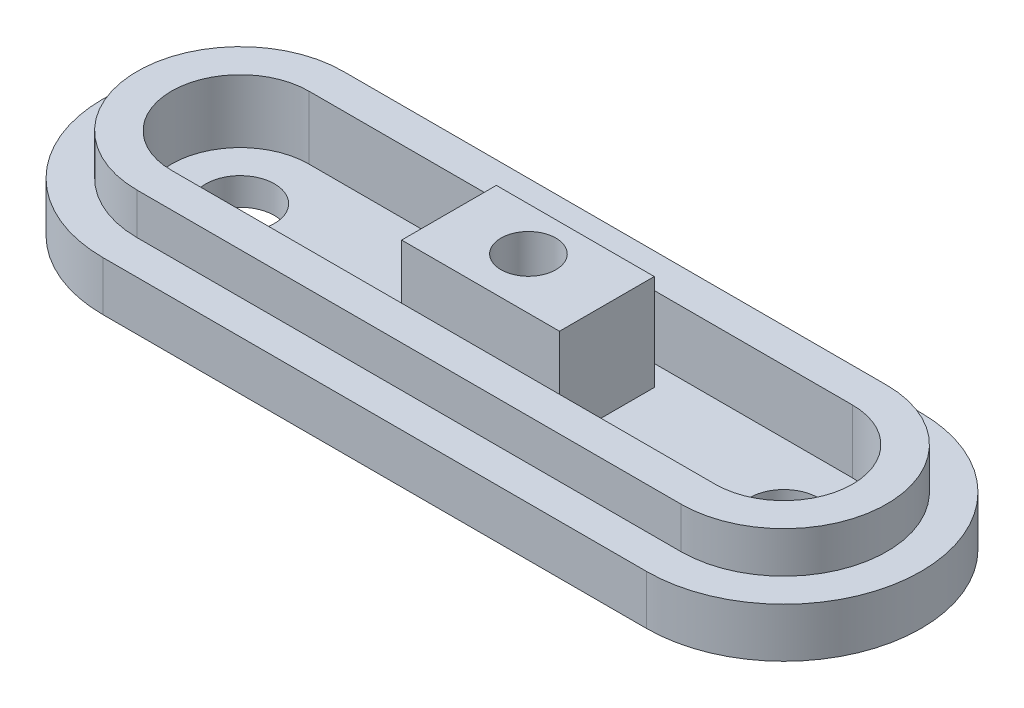
ISO-10303-21;
HEADER;
FILE_DESCRIPTION(('STEP AP214'),'2;1');
FILE_NAME('part.step','',(''),(''),'','','');
FILE_SCHEMA(('AUTOMOTIVE_DESIGN { 1 0 10303 214 1 1 1 1 }'));
ENDSEC;
DATA;
#1=APPLICATION_CONTEXT('core data for automotive mechanical design processes');
#2=APPLICATION_PROTOCOL_DEFINITION('international standard','automotive_design',2000,#1);
#3=PRODUCT_CONTEXT('',#1,'mechanical');
#4=PRODUCT('Part','Part','',(#3));
#5=PRODUCT_RELATED_PRODUCT_CATEGORY('part','',(#4));
#6=PRODUCT_DEFINITION_FORMATION('','',#4);
#7=PRODUCT_DEFINITION_CONTEXT('part definition',#1,'design');
#8=PRODUCT_DEFINITION('design','',#6,#7);
#9=PRODUCT_DEFINITION_SHAPE('','',#8);
#10=(LENGTH_UNIT() NAMED_UNIT(*) SI_UNIT(.MILLI.,.METRE.));
#11=(NAMED_UNIT(*) PLANE_ANGLE_UNIT() SI_UNIT($,.RADIAN.));
#12=(NAMED_UNIT(*) SI_UNIT($,.STERADIAN.) SOLID_ANGLE_UNIT());
#13=UNCERTAINTY_MEASURE_WITH_UNIT(LENGTH_MEASURE(1.E-05),#10,'distance_accuracy_value','');
#14=(GEOMETRIC_REPRESENTATION_CONTEXT(3) GLOBAL_UNCERTAINTY_ASSIGNED_CONTEXT((#13)) GLOBAL_UNIT_ASSIGNED_CONTEXT((#10,
#11,#12)) REPRESENTATION_CONTEXT('',''));
#15=CARTESIAN_POINT('',(0.,0.,0.));
#16=DIRECTION('',(0.,0.,1.));
#17=DIRECTION('',(1.,0.,0.));
#18=AXIS2_PLACEMENT_3D('',#15,#16,#17);
#19=CARTESIAN_POINT('',(201.676156477763,2.,0.327234865387502));
#20=DIRECTION('',(0.,-1.,0.));
#21=DIRECTION('',(0.,0.,-1.));
#22=AXIS2_PLACEMENT_3D('',#19,#20,#21);
#23=PLANE('',#22);
#24=CARTESIAN_POINT('',(201.676156477763,2.,0.327234865387502));
#25=DIRECTION('',(0.,-1.,0.));
#26=DIRECTION('',(0.,0.,-1.));
#27=AXIS2_PLACEMENT_3D('',#24,#25,#26);
#28=CIRCLE('',#27,50.);
#29=CARTESIAN_POINT('',(201.676156477763,2.,-49.6727651346125));
#30=VERTEX_POINT('',#29);
#31=CARTESIAN_POINT('',(201.676156477763,2.,50.3272348653875));
#32=VERTEX_POINT('',#31);
#33=EDGE_CURVE('E187',#30,#32,#28,.T.);
#34=ORIENTED_EDGE('',*,*,#33,.F.);
#35=DIRECTION('',(-1.,0.,0.));
#36=VECTOR('',#35,1.);
#37=CARTESIAN_POINT('',(-194.323843522237,2.,-49.6727651346125));
#38=LINE('',#37,#36);
#39=CARTESIAN_POINT('',(-194.323843522237,2.,-49.6727651346125));
#40=VERTEX_POINT('',#39);
#41=EDGE_CURVE('E195',#30,#40,#38,.T.);
#42=ORIENTED_EDGE('',*,*,#41,.T.);
#43=CARTESIAN_POINT('',(-194.323843522237,2.,0.327234865387502));
#44=DIRECTION('',(0.,-1.,0.));
#45=DIRECTION('',(0.,0.,-1.));
#46=AXIS2_PLACEMENT_3D('',#43,#44,#45);
#47=CIRCLE('',#46,50.);
#48=CARTESIAN_POINT('',(-194.323843522237,2.,50.3272348653875));
#49=VERTEX_POINT('',#48);
#50=EDGE_CURVE('E193',#49,#40,#47,.T.);
#51=ORIENTED_EDGE('',*,*,#50,.F.);
#52=DIRECTION('',(1.,0.,0.));
#53=VECTOR('',#52,1.);
#54=CARTESIAN_POINT('',(-194.323843522237,2.,50.3272348653875));
#55=LINE('',#54,#53);
#56=EDGE_CURVE('E189',#49,#32,#55,.T.);
#57=ORIENTED_EDGE('',*,*,#56,.T.);
#58=EDGE_LOOP('',(#34,#42,#51,#57));
#59=FACE_BOUND('',#58,.T.);
#60=CARTESIAN_POINT('',(201.676156477763,2.,0.327234865387502));
#61=DIRECTION('',(0.,-1.,0.));
#62=DIRECTION('',(0.,0.,-1.));
#63=AXIS2_PLACEMENT_3D('',#60,#61,#62);
#64=CIRCLE('',#63,25.);
#65=CARTESIAN_POINT('',(201.676156477763,2.,-24.6727651346125));
#66=VERTEX_POINT('',#65);
#67=EDGE_CURVE('E184',#66,#66,#64,.F.);
#68=ORIENTED_EDGE('',*,*,#67,.F.);
#69=EDGE_LOOP('',(#68));
#70=FACE_BOUND('',#69,.T.);
#71=CARTESIAN_POINT('',(-194.323843522237,2.,0.327234865387502));
#72=DIRECTION('',(0.,-1.,0.));
#73=DIRECTION('',(0.,0.,-1.));
#74=AXIS2_PLACEMENT_3D('',#71,#72,#73);
#75=CIRCLE('',#74,25.);
#76=CARTESIAN_POINT('',(-194.323843522237,2.,-24.6727651346125));
#77=VERTEX_POINT('',#76);
#78=EDGE_CURVE('E201',#77,#77,#75,.F.);
#79=ORIENTED_EDGE('',*,*,#78,.F.);
#80=EDGE_LOOP('',(#79));
#81=FACE_BOUND('',#80,.T.);
#82=DIRECTION('',(1.,0.,0.));
#83=VECTOR('',#82,1.);
#84=CARTESIAN_POINT('',(201.676156477763,2.,34.5));
#85=LINE('',#84,#83);
#86=CARTESIAN_POINT('',(-42.5384432151375,1.99999999999999,34.5));
#87=VERTEX_POINT('',#86);
#88=CARTESIAN_POINT('',(72.4615567848625,1.99999999999999,34.5));
#89=VERTEX_POINT('',#88);
#90=EDGE_CURVE('E11',#87,#89,#85,.T.);
#91=ORIENTED_EDGE('',*,*,#90,.F.);
#92=DIRECTION('',(0.,0.,1.));
#93=VECTOR('',#92,1.);
#94=CARTESIAN_POINT('',(-42.5384432151375,2.,0.327234865387502));
#95=LINE('',#94,#93);
#96=CARTESIAN_POINT('',(-42.5384432151375,1.99999999999999,-34.5));
#97=VERTEX_POINT('',#96);
#98=EDGE_CURVE('E45',#97,#87,#95,.T.);
#99=ORIENTED_EDGE('',*,*,#98,.F.);
#100=DIRECTION('',(1.,0.,0.));
#101=VECTOR('',#100,1.);
#102=CARTESIAN_POINT('',(201.676156477763,2.,-34.5));
#103=LINE('',#102,#101);
#104=CARTESIAN_POINT('',(72.4615567848625,2.,-34.5));
#105=VERTEX_POINT('',#104);
#106=EDGE_CURVE('E281',#97,#105,#103,.T.);
#107=ORIENTED_EDGE('',*,*,#106,.T.);
#108=DIRECTION('',(0.,0.,-1.));
#109=VECTOR('',#108,1.);
#110=CARTESIAN_POINT('',(72.4615567848625,2.,0.327234865387502));
#111=LINE('',#110,#109);
#112=EDGE_CURVE('E288',#89,#105,#111,.T.);
#113=ORIENTED_EDGE('',*,*,#112,.F.);
#114=EDGE_LOOP('',(#91,#99,#107,#113));
#115=FACE_BOUND('',#114,.T.);
#116=ADVANCED_FACE('F37',(#59,#70,#81,#115),#23,.F.);
#117=CARTESIAN_POINT('',(-194.323843522237,48.,0.327234865387502));
#118=DIRECTION('',(0.,-1.,0.));
#119=DIRECTION('',(0.,0.,-1.));
#120=AXIS2_PLACEMENT_3D('',#117,#118,#119);
#121=PLANE('',#120);
#122=DIRECTION('',(-1.,0.,0.));
#123=VECTOR('',#122,1.);
#124=CARTESIAN_POINT('',(-194.323843522237,48.,75.3272348653875));
#125=LINE('',#124,#123);
#126=CARTESIAN_POINT('',(201.676156477763,48.,75.3272348653875));
#127=VERTEX_POINT('',#126);
#128=CARTESIAN_POINT('',(-194.323843522237,48.,75.3272348653875));
#129=VERTEX_POINT('',#128);
#130=EDGE_CURVE('E216',#127,#129,#125,.T.);
#131=ORIENTED_EDGE('',*,*,#130,.F.);
#132=CARTESIAN_POINT('',(201.676156477763,48.,0.327234865387502));
#133=DIRECTION('',(0.,-1.,0.));
#134=DIRECTION('',(0.,0.,-1.));
#135=AXIS2_PLACEMENT_3D('',#132,#133,#134);
#136=CIRCLE('',#135,75.);
#137=CARTESIAN_POINT('',(201.676156477763,48.,-74.6727651346125));
#138=VERTEX_POINT('',#137);
#139=EDGE_CURVE('E225',#138,#127,#136,.T.);
#140=ORIENTED_EDGE('',*,*,#139,.F.);
#141=DIRECTION('',(1.,0.,0.));
#142=VECTOR('',#141,1.);
#143=CARTESIAN_POINT('',(-194.323843522237,48.,-74.6727651346125));
#144=LINE('',#143,#142);
#145=CARTESIAN_POINT('',(-194.323843522237,48.,-74.6727651346125));
#146=VERTEX_POINT('',#145);
#147=EDGE_CURVE('E222',#146,#138,#144,.T.);
#148=ORIENTED_EDGE('',*,*,#147,.F.);
#149=CARTESIAN_POINT('',(-194.323843522237,48.,0.327234865387502));
#150=DIRECTION('',(0.,-1.,0.));
#151=DIRECTION('',(0.,0.,-1.));
#152=AXIS2_PLACEMENT_3D('',#149,#150,#151);
#153=CIRCLE('',#152,75.);
#154=EDGE_CURVE('E219',#129,#146,#153,.T.);
#155=ORIENTED_EDGE('',*,*,#154,.F.);
#156=EDGE_LOOP('',(#131,#140,#148,#155));
#157=FACE_BOUND('',#156,.T.);
#158=CARTESIAN_POINT('',(201.676156477763,48.,0.327234865387502));
#159=DIRECTION('',(0.,-1.,0.));
#160=DIRECTION('',(0.,0.,-1.));
#161=AXIS2_PLACEMENT_3D('',#158,#159,#160);
#162=CIRCLE('',#161,50.);
#163=CARTESIAN_POINT('',(201.676156477763,48.,-49.6727651346125));
#164=VERTEX_POINT('',#163);
#165=CARTESIAN_POINT('',(201.676156477763,48.,50.3272348653875));
#166=VERTEX_POINT('',#165);
#167=EDGE_CURVE('E60',#164,#166,#162,.T.);
#168=ORIENTED_EDGE('',*,*,#167,.T.);
#169=DIRECTION('',(1.,0.,0.));
#170=VECTOR('',#169,1.);
#171=CARTESIAN_POINT('',(-194.323843522237,48.,50.3272348653875));
#172=LINE('',#171,#170);
#173=CARTESIAN_POINT('',(-194.323843522237,48.,50.3272348653875));
#174=VERTEX_POINT('',#173);
#175=EDGE_CURVE('E200',#174,#166,#172,.T.);
#176=ORIENTED_EDGE('',*,*,#175,.F.);
#177=CARTESIAN_POINT('',(-194.323843522237,48.,0.327234865387502));
#178=DIRECTION('',(0.,-1.,0.));
#179=DIRECTION('',(0.,0.,-1.));
#180=AXIS2_PLACEMENT_3D('',#177,#178,#179);
#181=CIRCLE('',#180,50.);
#182=CARTESIAN_POINT('',(-194.323843522237,48.,-49.6727651346125));
#183=VERTEX_POINT('',#182);
#184=EDGE_CURVE('E204',#174,#183,#181,.T.);
#185=ORIENTED_EDGE('',*,*,#184,.T.);
#186=DIRECTION('',(-1.,0.,0.));
#187=VECTOR('',#186,1.);
#188=CARTESIAN_POINT('',(-194.323843522237,48.,-49.6727651346125));
#189=LINE('',#188,#187);
#190=EDGE_CURVE('E190',#164,#183,#189,.T.);
#191=ORIENTED_EDGE('',*,*,#190,.F.);
#192=EDGE_LOOP('',(#168,#176,#185,#191));
#193=FACE_BOUND('',#192,.T.);
#194=ADVANCED_FACE('F306',(#157,#193),#121,.F.);
#195=CARTESIAN_POINT('',(-194.323843522237,18.,0.327234865387502));
#196=DIRECTION('',(0.,-1.,0.));
#197=DIRECTION('',(0.,0.,-1.));
#198=AXIS2_PLACEMENT_3D('',#195,#196,#197);
#199=CYLINDRICAL_SURFACE('',#198,100.);
#200=CARTESIAN_POINT('',(-194.323843522237,-18.,0.327234865387502));
#201=DIRECTION('',(0.,1.,0.));
#202=DIRECTION('',(0.,0.,-1.));
#203=AXIS2_PLACEMENT_3D('',#200,#201,#202);
#204=CIRCLE('',#203,100.);
#205=CARTESIAN_POINT('',(-194.323843522237,-18.,-99.6727651346125));
#206=VERTEX_POINT('',#205);
#207=CARTESIAN_POINT('',(-194.323843522237,-18.,100.327234865388));
#208=VERTEX_POINT('',#207);
#209=EDGE_CURVE('E251',#206,#208,#204,.T.);
#210=ORIENTED_EDGE('',*,*,#209,.T.);
#211=DIRECTION('',(0.,-1.,0.));
#212=VECTOR('',#211,1.);
#213=CARTESIAN_POINT('',(-194.323843522237,18.,100.327234865388));
#214=LINE('',#213,#212);
#215=CARTESIAN_POINT('',(-194.323843522237,18.,100.327234865388));
#216=VERTEX_POINT('',#215);
#217=EDGE_CURVE('E278',#216,#208,#214,.T.);
#218=ORIENTED_EDGE('',*,*,#217,.F.);
#219=CARTESIAN_POINT('',(-194.323843522237,18.,0.327234865387502));
#220=DIRECTION('',(0.,1.,0.));
#221=DIRECTION('',(0.,0.,-1.));
#222=AXIS2_PLACEMENT_3D('',#219,#220,#221);
#223=CIRCLE('',#222,100.);
#224=CARTESIAN_POINT('',(-194.323843522237,18.,-99.6727651346125));
#225=VERTEX_POINT('',#224);
#226=EDGE_CURVE('E252',#225,#216,#223,.T.);
#227=ORIENTED_EDGE('',*,*,#226,.F.);
#228=DIRECTION('',(0.,-1.,0.));
#229=VECTOR('',#228,1.);
#230=CARTESIAN_POINT('',(-194.323843522237,18.,-99.6727651346125));
#231=LINE('',#230,#229);
#232=EDGE_CURVE('E262',#225,#206,#231,.T.);
#233=ORIENTED_EDGE('',*,*,#232,.T.);
#234=EDGE_LOOP('',(#210,#218,#227,#233));
#235=FACE_BOUND('',#234,.T.);
#236=ADVANCED_FACE('F39',(#235),#199,.T.);
#237=CARTESIAN_POINT('',(-194.323843522237,18.,100.327234865388));
#238=DIRECTION('',(0.,0.,-1.));
#239=DIRECTION('',(-1.,0.,0.));
#240=AXIS2_PLACEMENT_3D('',#237,#238,#239);
#241=PLANE('',#240);
#242=DIRECTION('',(1.,0.,0.));
#243=VECTOR('',#242,1.);
#244=CARTESIAN_POINT('',(-194.323843522237,-18.,100.327234865388));
#245=LINE('',#244,#243);
#246=CARTESIAN_POINT('',(201.676156477763,-18.,100.327234865388));
#247=VERTEX_POINT('',#246);
#248=EDGE_CURVE('E265',#208,#247,#245,.T.);
#249=ORIENTED_EDGE('',*,*,#248,.T.);
#250=DIRECTION('',(0.,-1.,0.));
#251=VECTOR('',#250,1.);
#252=CARTESIAN_POINT('',(201.676156477763,18.,100.327234865388));
#253=LINE('',#252,#251);
#254=CARTESIAN_POINT('',(201.676156477763,18.,100.327234865388));
#255=VERTEX_POINT('',#254);
#256=EDGE_CURVE('E275',#255,#247,#253,.T.);
#257=ORIENTED_EDGE('',*,*,#256,.F.);
#258=DIRECTION('',(1.,0.,0.));
#259=VECTOR('',#258,1.);
#260=CARTESIAN_POINT('',(-194.323843522237,18.,100.327234865388));
#261=LINE('',#260,#259);
#262=EDGE_CURVE('E255',#216,#255,#261,.T.);
#263=ORIENTED_EDGE('',*,*,#262,.F.);
#264=ORIENTED_EDGE('',*,*,#217,.T.);
#265=EDGE_LOOP('',(#249,#257,#263,#264));
#266=FACE_BOUND('',#265,.T.);
#267=ADVANCED_FACE('F365',(#266),#241,.F.);
#268=CARTESIAN_POINT('',(201.676156477763,18.,0.327234865387502));
#269=DIRECTION('',(0.,-1.,0.));
#270=DIRECTION('',(0.,0.,-1.));
#271=AXIS2_PLACEMENT_3D('',#268,#269,#270);
#272=CYLINDRICAL_SURFACE('',#271,100.);
#273=CARTESIAN_POINT('',(201.676156477763,-18.,0.327234865387502));
#274=DIRECTION('',(0.,1.,0.));
#275=DIRECTION('',(0.,0.,1.));
#276=AXIS2_PLACEMENT_3D('',#273,#274,#275);
#277=CIRCLE('',#276,100.);
#278=CARTESIAN_POINT('',(201.676156477763,-18.,-99.6727651346125));
#279=VERTEX_POINT('',#278);
#280=EDGE_CURVE('E267',#247,#279,#277,.T.);
#281=ORIENTED_EDGE('',*,*,#280,.T.);
#282=DIRECTION('',(0.,-1.,0.));
#283=VECTOR('',#282,1.);
#284=CARTESIAN_POINT('',(201.676156477763,18.,-99.6727651346125));
#285=LINE('',#284,#283);
#286=CARTESIAN_POINT('',(201.676156477763,18.,-99.6727651346125));
#287=VERTEX_POINT('',#286);
#288=EDGE_CURVE('E272',#287,#279,#285,.T.);
#289=ORIENTED_EDGE('',*,*,#288,.F.);
#290=CARTESIAN_POINT('',(201.676156477763,18.,0.327234865387502));
#291=DIRECTION('',(0.,1.,0.));
#292=DIRECTION('',(0.,0.,1.));
#293=AXIS2_PLACEMENT_3D('',#290,#291,#292);
#294=CIRCLE('',#293,100.);
#295=EDGE_CURVE('E258',#255,#287,#294,.T.);
#296=ORIENTED_EDGE('',*,*,#295,.F.);
#297=ORIENTED_EDGE('',*,*,#256,.T.);
#298=EDGE_LOOP('',(#281,#289,#296,#297));
#299=FACE_BOUND('',#298,.T.);
#300=ADVANCED_FACE('F362',(#299),#272,.T.);
#301=CARTESIAN_POINT('',(-194.323843522237,18.,-99.6727651346125));
#302=DIRECTION('',(0.,0.,1.));
#303=DIRECTION('',(1.,0.,0.));
#304=AXIS2_PLACEMENT_3D('',#301,#302,#303);
#305=PLANE('',#304);
#306=DIRECTION('',(-1.,0.,0.));
#307=VECTOR('',#306,1.);
#308=CARTESIAN_POINT('',(-194.323843522237,-18.,-99.6727651346125));
#309=LINE('',#308,#307);
#310=EDGE_CURVE('E256',#279,#206,#309,.T.);
#311=ORIENTED_EDGE('',*,*,#310,.T.);
#312=ORIENTED_EDGE('',*,*,#232,.F.);
#313=DIRECTION('',(-1.,0.,0.));
#314=VECTOR('',#313,1.);
#315=CARTESIAN_POINT('',(-194.323843522237,18.,-99.6727651346125));
#316=LINE('',#315,#314);
#317=EDGE_CURVE('E260',#287,#225,#316,.T.);
#318=ORIENTED_EDGE('',*,*,#317,.F.);
#319=ORIENTED_EDGE('',*,*,#288,.T.);
#320=EDGE_LOOP('',(#311,#312,#318,#319));
#321=FACE_BOUND('',#320,.T.);
#322=ADVANCED_FACE('F355',(#321),#305,.F.);
#323=CARTESIAN_POINT('',(-194.323843522237,18.,0.327234865387502));
#324=DIRECTION('',(0.,-1.,0.));
#325=DIRECTION('',(0.,0.,-1.));
#326=AXIS2_PLACEMENT_3D('',#323,#324,#325);
#327=PLANE('',#326);
#328=CARTESIAN_POINT('',(201.676156477763,18.,0.327234865387502));
#329=DIRECTION('',(0.,-1.,0.));
#330=DIRECTION('',(0.,0.,-1.));
#331=AXIS2_PLACEMENT_3D('',#328,#329,#330);
#332=CIRCLE('',#331,75.);
#333=CARTESIAN_POINT('',(201.676156477763,18.,-74.6727651346125));
#334=VERTEX_POINT('',#333);
#335=CARTESIAN_POINT('',(201.676156477763,18.,75.3272348653875));
#336=VERTEX_POINT('',#335);
#337=EDGE_CURVE('E245',#334,#336,#332,.T.);
#338=ORIENTED_EDGE('',*,*,#337,.T.);
#339=DIRECTION('',(-1.,0.,0.));
#340=VECTOR('',#339,1.);
#341=CARTESIAN_POINT('',(-194.323843522237,18.,75.3272348653875));
#342=LINE('',#341,#340);
#343=CARTESIAN_POINT('',(-194.323843522237,18.,75.3272348653875));
#344=VERTEX_POINT('',#343);
#345=EDGE_CURVE('E248',#336,#344,#342,.T.);
#346=ORIENTED_EDGE('',*,*,#345,.T.);
#347=CARTESIAN_POINT('',(-194.323843522237,18.,0.327234865387502));
#348=DIRECTION('',(0.,-1.,0.));
#349=DIRECTION('',(0.,0.,-1.));
#350=AXIS2_PLACEMENT_3D('',#347,#348,#349);
#351=CIRCLE('',#350,75.);
#352=CARTESIAN_POINT('',(-194.323843522237,18.,-74.6727651346125));
#353=VERTEX_POINT('',#352);
#354=EDGE_CURVE('E232',#344,#353,#351,.T.);
#355=ORIENTED_EDGE('',*,*,#354,.T.);
#356=DIRECTION('',(1.,0.,0.));
#357=VECTOR('',#356,1.);
#358=CARTESIAN_POINT('',(-194.323843522237,18.,-74.6727651346125));
#359=LINE('',#358,#357);
#360=EDGE_CURVE('E242',#353,#334,#359,.T.);
#361=ORIENTED_EDGE('',*,*,#360,.T.);
#362=EDGE_LOOP('',(#338,#346,#355,#361));
#363=FACE_BOUND('',#362,.T.);
#364=ORIENTED_EDGE('',*,*,#226,.T.);
#365=ORIENTED_EDGE('',*,*,#262,.T.);
#366=ORIENTED_EDGE('',*,*,#295,.T.);
#367=ORIENTED_EDGE('',*,*,#317,.T.);
#368=EDGE_LOOP('',(#364,#365,#366,#367));
#369=FACE_BOUND('',#368,.T.);
#370=ADVANCED_FACE('F352',(#363,#369),#327,.F.);
#371=CARTESIAN_POINT('',(-194.323843522237,-18.,0.327234865387502));
#372=DIRECTION('',(0.,-1.,0.));
#373=DIRECTION('',(0.,0.,-1.));
#374=AXIS2_PLACEMENT_3D('',#371,#372,#373);
#375=PLANE('',#374);
#376=CARTESIAN_POINT('',(12.3670953048505,-18.,-2.9639564488447));
#377=DIRECTION('',(0.,-1.,0.));
#378=DIRECTION('',(0.,0.,-1.));
#379=AXIS2_PLACEMENT_3D('',#376,#377,#378);
#380=CIRCLE('',#379,20.);
#381=CARTESIAN_POINT('',(12.3670953048505,-18.,17.0360435511553));
#382=VERTEX_POINT('',#381);
#383=EDGE_CURVE('E177',#382,#382,#380,.T.);
#384=ORIENTED_EDGE('',*,*,#383,.F.);
#385=EDGE_LOOP('',(#384));
#386=FACE_BOUND('',#385,.T.);
#387=CARTESIAN_POINT('',(-194.323843522237,-18.,0.327234865387502));
#388=DIRECTION('',(0.,-1.,0.));
#389=DIRECTION('',(0.,0.,-1.));
#390=AXIS2_PLACEMENT_3D('',#387,#388,#389);
#391=CIRCLE('',#390,25.);
#392=CARTESIAN_POINT('',(-194.323843522237,-18.,-24.6727651346125));
#393=VERTEX_POINT('',#392);
#394=EDGE_CURVE('E181',#393,#393,#391,.T.);
#395=ORIENTED_EDGE('',*,*,#394,.F.);
#396=EDGE_LOOP('',(#395));
#397=FACE_BOUND('',#396,.T.);
#398=CARTESIAN_POINT('',(201.676156477763,-18.,0.327234865387502));
#399=DIRECTION('',(0.,-1.,0.));
#400=DIRECTION('',(0.,0.,-1.));
#401=AXIS2_PLACEMENT_3D('',#398,#399,#400);
#402=CIRCLE('',#401,25.);
#403=CARTESIAN_POINT('',(201.676156477763,-18.,-24.6727651346125));
#404=VERTEX_POINT('',#403);
#405=EDGE_CURVE('E164',#404,#404,#402,.T.);
#406=ORIENTED_EDGE('',*,*,#405,.F.);
#407=EDGE_LOOP('',(#406));
#408=FACE_BOUND('',#407,.T.);
#409=ORIENTED_EDGE('',*,*,#209,.F.);
#410=ORIENTED_EDGE('',*,*,#310,.F.);
#411=ORIENTED_EDGE('',*,*,#280,.F.);
#412=ORIENTED_EDGE('',*,*,#248,.F.);
#413=EDGE_LOOP('',(#409,#410,#411,#412));
#414=FACE_BOUND('',#413,.T.);
#415=ADVANCED_FACE('F350',(#386,#397,#408,#414),#375,.T.);
#416=CARTESIAN_POINT('',(-194.323843522237,48.,75.3272348653875));
#417=DIRECTION('',(0.,0.,1.));
#418=DIRECTION('',(1.,0.,0.));
#419=AXIS2_PLACEMENT_3D('',#416,#417,#418);
#420=PLANE('',#419);
#421=ORIENTED_EDGE('',*,*,#345,.F.);
#422=DIRECTION('',(0.,-1.,0.));
#423=VECTOR('',#422,1.);
#424=CARTESIAN_POINT('',(201.676156477763,48.,75.3272348653875));
#425=LINE('',#424,#423);
#426=EDGE_CURVE('E229',#127,#336,#425,.T.);
#427=ORIENTED_EDGE('',*,*,#426,.F.);
#428=ORIENTED_EDGE('',*,*,#130,.T.);
#429=DIRECTION('',(0.,-1.,0.));
#430=VECTOR('',#429,1.);
#431=CARTESIAN_POINT('',(-194.323843522237,48.,75.3272348653875));
#432=LINE('',#431,#430);
#433=EDGE_CURVE('E228',#129,#344,#432,.T.);
#434=ORIENTED_EDGE('',*,*,#433,.T.);
#435=EDGE_LOOP('',(#421,#427,#428,#434));
#436=FACE_BOUND('',#435,.T.);
#437=ADVANCED_FACE('F340',(#436),#420,.T.);
#438=CARTESIAN_POINT('',(201.676156477763,48.,0.327234865387502));
#439=DIRECTION('',(0.,-1.,0.));
#440=DIRECTION('',(0.,0.,-1.));
#441=AXIS2_PLACEMENT_3D('',#438,#439,#440);
#442=CYLINDRICAL_SURFACE('',#441,75.);
#443=ORIENTED_EDGE('',*,*,#337,.F.);
#444=DIRECTION('',(0.,-1.,0.));
#445=VECTOR('',#444,1.);
#446=CARTESIAN_POINT('',(201.676156477763,48.,-74.6727651346125));
#447=LINE('',#446,#445);
#448=EDGE_CURVE('E233',#138,#334,#447,.T.);
#449=ORIENTED_EDGE('',*,*,#448,.F.);
#450=ORIENTED_EDGE('',*,*,#139,.T.);
#451=ORIENTED_EDGE('',*,*,#426,.T.);
#452=EDGE_LOOP('',(#443,#449,#450,#451));
#453=FACE_BOUND('',#452,.T.);
#454=ADVANCED_FACE('F336',(#453),#442,.T.);
#455=CARTESIAN_POINT('',(-194.323843522237,48.,-74.6727651346125));
#456=DIRECTION('',(0.,0.,-1.));
#457=DIRECTION('',(-1.,0.,0.));
#458=AXIS2_PLACEMENT_3D('',#455,#456,#457);
#459=PLANE('',#458);
#460=ORIENTED_EDGE('',*,*,#360,.F.);
#461=DIRECTION('',(0.,-1.,0.));
#462=VECTOR('',#461,1.);
#463=CARTESIAN_POINT('',(-194.323843522237,48.,-74.6727651346125));
#464=LINE('',#463,#462);
#465=EDGE_CURVE('E236',#146,#353,#464,.T.);
#466=ORIENTED_EDGE('',*,*,#465,.F.);
#467=ORIENTED_EDGE('',*,*,#147,.T.);
#468=ORIENTED_EDGE('',*,*,#448,.T.);
#469=EDGE_LOOP('',(#460,#466,#467,#468));
#470=FACE_BOUND('',#469,.T.);
#471=ADVANCED_FACE('F339',(#470),#459,.T.);
#472=CARTESIAN_POINT('',(-194.323843522237,48.,0.327234865387502));
#473=DIRECTION('',(0.,-1.,0.));
#474=DIRECTION('',(0.,0.,-1.));
#475=AXIS2_PLACEMENT_3D('',#472,#473,#474);
#476=CYLINDRICAL_SURFACE('',#475,75.);
#477=ORIENTED_EDGE('',*,*,#354,.F.);
#478=ORIENTED_EDGE('',*,*,#433,.F.);
#479=ORIENTED_EDGE('',*,*,#154,.T.);
#480=ORIENTED_EDGE('',*,*,#465,.T.);
#481=EDGE_LOOP('',(#477,#478,#479,#480));
#482=FACE_BOUND('',#481,.T.);
#483=ADVANCED_FACE('F334',(#482),#476,.T.);
#484=CARTESIAN_POINT('',(201.676156477763,2.,0.327234865387502));
#485=DIRECTION('',(0.,1.,0.));
#486=DIRECTION('',(0.,0.,1.));
#487=AXIS2_PLACEMENT_3D('',#484,#485,#486);
#488=CYLINDRICAL_SURFACE('',#487,50.);
#489=ORIENTED_EDGE('',*,*,#167,.F.);
#490=DIRECTION('',(0.,1.,0.));
#491=VECTOR('',#490,1.);
#492=CARTESIAN_POINT('',(201.676156477763,2.,-49.6727651346125));
#493=LINE('',#492,#491);
#494=EDGE_CURVE('E198',#30,#164,#493,.T.);
#495=ORIENTED_EDGE('',*,*,#494,.F.);
#496=ORIENTED_EDGE('',*,*,#33,.T.);
#497=DIRECTION('',(0.,1.,0.));
#498=VECTOR('',#497,1.);
#499=CARTESIAN_POINT('',(201.676156477763,2.,50.3272348653875));
#500=LINE('',#499,#498);
#501=EDGE_CURVE('E214',#32,#166,#500,.T.);
#502=ORIENTED_EDGE('',*,*,#501,.T.);
#503=EDGE_LOOP('',(#489,#495,#496,#502));
#504=FACE_BOUND('',#503,.T.);
#505=ADVANCED_FACE('F331',(#504),#488,.F.);
#506=CARTESIAN_POINT('',(-194.323843522237,2.,50.3272348653875));
#507=DIRECTION('',(0.,0.,1.));
#508=DIRECTION('',(1.,0.,0.));
#509=AXIS2_PLACEMENT_3D('',#506,#507,#508);
#510=PLANE('',#509);
#511=ORIENTED_EDGE('',*,*,#175,.T.);
#512=ORIENTED_EDGE('',*,*,#501,.F.);
#513=ORIENTED_EDGE('',*,*,#56,.F.);
#514=DIRECTION('',(0.,1.,0.));
#515=VECTOR('',#514,1.);
#516=CARTESIAN_POINT('',(-194.323843522237,2.,50.3272348653875));
#517=LINE('',#516,#515);
#518=EDGE_CURVE('E212',#49,#174,#517,.T.);
#519=ORIENTED_EDGE('',*,*,#518,.T.);
#520=EDGE_LOOP('',(#511,#512,#513,#519));
#521=FACE_BOUND('',#520,.T.);
#522=ADVANCED_FACE('F327',(#521),#510,.F.);
#523=CARTESIAN_POINT('',(-194.323843522237,2.,0.327234865387502));
#524=DIRECTION('',(0.,1.,0.));
#525=DIRECTION('',(0.,0.,1.));
#526=AXIS2_PLACEMENT_3D('',#523,#524,#525);
#527=CYLINDRICAL_SURFACE('',#526,50.);
#528=ORIENTED_EDGE('',*,*,#184,.F.);
#529=ORIENTED_EDGE('',*,*,#518,.F.);
#530=ORIENTED_EDGE('',*,*,#50,.T.);
#531=DIRECTION('',(0.,1.,0.));
#532=VECTOR('',#531,1.);
#533=CARTESIAN_POINT('',(-194.323843522237,2.,-49.6727651346125));
#534=LINE('',#533,#532);
#535=EDGE_CURVE('E210',#40,#183,#534,.T.);
#536=ORIENTED_EDGE('',*,*,#535,.T.);
#537=EDGE_LOOP('',(#528,#529,#530,#536));
#538=FACE_BOUND('',#537,.T.);
#539=ADVANCED_FACE('F323',(#538),#527,.F.);
#540=CARTESIAN_POINT('',(-194.323843522237,2.,-49.6727651346125));
#541=DIRECTION('',(0.,0.,-1.));
#542=DIRECTION('',(-1.,0.,0.));
#543=AXIS2_PLACEMENT_3D('',#540,#541,#542);
#544=PLANE('',#543);
#545=ORIENTED_EDGE('',*,*,#190,.T.);
#546=ORIENTED_EDGE('',*,*,#535,.F.);
#547=ORIENTED_EDGE('',*,*,#41,.F.);
#548=ORIENTED_EDGE('',*,*,#494,.T.);
#549=EDGE_LOOP('',(#545,#546,#547,#548));
#550=FACE_BOUND('',#549,.T.);
#551=ADVANCED_FACE('F320',(#550),#544,.F.);
#552=CARTESIAN_POINT('',(201.676156477763,-18.,0.327234865387502));
#553=DIRECTION('',(0.,1.,0.));
#554=DIRECTION('',(0.,0.,1.));
#555=AXIS2_PLACEMENT_3D('',#552,#553,#554);
#556=CYLINDRICAL_SURFACE('',#555,25.);
#557=ORIENTED_EDGE('',*,*,#405,.T.);
#558=EDGE_LOOP('',(#557));
#559=FACE_BOUND('',#558,.T.);
#560=ORIENTED_EDGE('',*,*,#67,.T.);
#561=EDGE_LOOP('',(#560));
#562=FACE_BOUND('',#561,.T.);
#563=ADVANCED_FACE('F318',(#559,#562),#556,.F.);
#564=CARTESIAN_POINT('',(-194.323843522237,-18.,0.327234865387502));
#565=DIRECTION('',(0.,1.,0.));
#566=DIRECTION('',(0.,0.,1.));
#567=AXIS2_PLACEMENT_3D('',#564,#565,#566);
#568=CYLINDRICAL_SURFACE('',#567,25.);
#569=ORIENTED_EDGE('',*,*,#394,.T.);
#570=EDGE_LOOP('',(#569));
#571=FACE_BOUND('',#570,.T.);
#572=ORIENTED_EDGE('',*,*,#78,.T.);
#573=EDGE_LOOP('',(#572));
#574=FACE_BOUND('',#573,.T.);
#575=ADVANCED_FACE('F433',(#571,#574),#568,.F.);
#576=CARTESIAN_POINT('',(-42.5384432151375,-18.,34.5));
#577=DIRECTION('',(1.,0.,0.));
#578=DIRECTION('',(0.,0.,-1.));
#579=AXIS2_PLACEMENT_3D('',#576,#577,#578);
#580=PLANE('',#579);
#581=DIRECTION('',(0.,-1.,0.));
#582=VECTOR('',#581,1.);
#583=CARTESIAN_POINT('',(-42.5384432151375,-18.,-34.5));
#584=LINE('',#583,#582);
#585=CARTESIAN_POINT('',(-42.5384432151375,72.,-34.5));
#586=VERTEX_POINT('',#585);
#587=EDGE_CURVE('E174',#586,#97,#584,.T.);
#588=ORIENTED_EDGE('',*,*,#587,.T.);
#589=ORIENTED_EDGE('',*,*,#98,.T.);
#590=DIRECTION('',(0.,-1.,0.));
#591=VECTOR('',#590,1.);
#592=CARTESIAN_POINT('',(-42.5384432151375,-18.,34.5));
#593=LINE('',#592,#591);
#594=CARTESIAN_POINT('',(-42.5384432151375,72.,34.5));
#595=VERTEX_POINT('',#594);
#596=EDGE_CURVE('E158',#595,#87,#593,.T.);
#597=ORIENTED_EDGE('',*,*,#596,.F.);
#598=DIRECTION('',(0.,0.,-1.));
#599=VECTOR('',#598,1.);
#600=CARTESIAN_POINT('',(-42.5384432151375,72.,34.5));
#601=LINE('',#600,#599);
#602=EDGE_CURVE('E165',#595,#586,#601,.T.);
#603=ORIENTED_EDGE('',*,*,#602,.T.);
#604=EDGE_LOOP('',(#588,#589,#597,#603));
#605=FACE_BOUND('',#604,.T.);
#606=ADVANCED_FACE('F291',(#605),#580,.F.);
#607=CARTESIAN_POINT('',(72.4615567848625,-18.,34.5));
#608=DIRECTION('',(-1.,0.,0.));
#609=DIRECTION('',(0.,0.,1.));
#610=AXIS2_PLACEMENT_3D('',#607,#608,#609);
#611=PLANE('',#610);
#612=DIRECTION('',(0.,1.,0.));
#613=VECTOR('',#612,1.);
#614=CARTESIAN_POINT('',(72.4615567848625,-18.,34.5));
#615=LINE('',#614,#613);
#616=CARTESIAN_POINT('',(72.4615567848625,72.,34.5));
#617=VERTEX_POINT('',#616);
#618=EDGE_CURVE('E148',#89,#617,#615,.T.);
#619=ORIENTED_EDGE('',*,*,#618,.F.);
#620=ORIENTED_EDGE('',*,*,#112,.T.);
#621=DIRECTION('',(0.,1.,0.));
#622=VECTOR('',#621,1.);
#623=CARTESIAN_POINT('',(72.4615567848625,-18.,-34.5));
#624=LINE('',#623,#622);
#625=CARTESIAN_POINT('',(72.4615567848625,72.,-34.5));
#626=VERTEX_POINT('',#625);
#627=EDGE_CURVE('E52',#105,#626,#624,.T.);
#628=ORIENTED_EDGE('',*,*,#627,.T.);
#629=DIRECTION('',(0.,0.,-1.));
#630=VECTOR('',#629,1.);
#631=CARTESIAN_POINT('',(72.4615567848625,72.,34.5));
#632=LINE('',#631,#630);
#633=EDGE_CURVE('E161',#617,#626,#632,.T.);
#634=ORIENTED_EDGE('',*,*,#633,.F.);
#635=EDGE_LOOP('',(#619,#620,#628,#634));
#636=FACE_BOUND('',#635,.T.);
#637=ADVANCED_FACE('F162',(#636),#611,.F.);
#638=CARTESIAN_POINT('',(0.,0.,34.5));
#639=DIRECTION('',(0.,0.,-1.));
#640=DIRECTION('',(-1.,0.,0.));
#641=AXIS2_PLACEMENT_3D('',#638,#639,#640);
#642=PLANE('',#641);
#643=ORIENTED_EDGE('',*,*,#596,.T.);
#644=ORIENTED_EDGE('',*,*,#90,.T.);
#645=ORIENTED_EDGE('',*,*,#618,.T.);
#646=DIRECTION('',(-1.,0.,0.));
#647=VECTOR('',#646,1.);
#648=CARTESIAN_POINT('',(-42.5384432151375,72.,34.5));
#649=LINE('',#648,#647);
#650=EDGE_CURVE('E153',#617,#595,#649,.T.);
#651=ORIENTED_EDGE('',*,*,#650,.T.);
#652=EDGE_LOOP('',(#643,#644,#645,#651));
#653=FACE_BOUND('',#652,.T.);
#654=ADVANCED_FACE('F151',(#653),#642,.F.);
#655=CARTESIAN_POINT('',(0.,0.,-34.5));
#656=DIRECTION('',(0.,0.,-1.));
#657=DIRECTION('',(-1.,0.,0.));
#658=AXIS2_PLACEMENT_3D('',#655,#656,#657);
#659=PLANE('',#658);
#660=ORIENTED_EDGE('',*,*,#106,.F.);
#661=ORIENTED_EDGE('',*,*,#587,.F.);
#662=DIRECTION('',(-1.,0.,0.));
#663=VECTOR('',#662,1.);
#664=CARTESIAN_POINT('',(-42.5384432151375,72.,-34.5));
#665=LINE('',#664,#663);
#666=EDGE_CURVE('E179',#626,#586,#665,.T.);
#667=ORIENTED_EDGE('',*,*,#666,.F.);
#668=ORIENTED_EDGE('',*,*,#627,.F.);
#669=EDGE_LOOP('',(#660,#661,#667,#668));
#670=FACE_BOUND('',#669,.T.);
#671=ADVANCED_FACE('F294',(#670),#659,.T.);
#672=CARTESIAN_POINT('',(-42.5384432151375,72.,34.5));
#673=DIRECTION('',(0.,-1.,0.));
#674=DIRECTION('',(0.,0.,-1.));
#675=AXIS2_PLACEMENT_3D('',#672,#673,#674);
#676=PLANE('',#675);
#677=CARTESIAN_POINT('',(12.3670953048505,72.,-2.9639564488447));
#678=DIRECTION('',(0.,-1.,0.));
#679=DIRECTION('',(0.,0.,-1.));
#680=AXIS2_PLACEMENT_3D('',#677,#678,#679);
#681=CIRCLE('',#680,20.);
#682=CARTESIAN_POINT('',(12.3670953048505,72.,17.0360435511553));
#683=VERTEX_POINT('',#682);
#684=EDGE_CURVE('E518',#683,#683,#681,.T.);
#685=ORIENTED_EDGE('',*,*,#684,.T.);
#686=EDGE_LOOP('',(#685));
#687=FACE_BOUND('',#686,.T.);
#688=ORIENTED_EDGE('',*,*,#666,.T.);
#689=ORIENTED_EDGE('',*,*,#602,.F.);
#690=ORIENTED_EDGE('',*,*,#650,.F.);
#691=ORIENTED_EDGE('',*,*,#633,.T.);
#692=EDGE_LOOP('',(#688,#689,#690,#691));
#693=FACE_BOUND('',#692,.T.);
#694=ADVANCED_FACE('F167',(#687,#693),#676,.F.);
#695=CARTESIAN_POINT('',(12.3670953048505,-18.,-2.9639564488447));
#696=DIRECTION('',(0.,1.,0.));
#697=DIRECTION('',(0.,0.,1.));
#698=AXIS2_PLACEMENT_3D('',#695,#696,#697);
#699=CYLINDRICAL_SURFACE('',#698,20.);
#700=CARTESIAN_POINT('',(12.3670953048505,-18.,17.0360435511553));
#701=CARTESIAN_POINT('',(12.3670953048505,-17.0625,17.0360435511553));
#702=CARTESIAN_POINT('',(12.3670953048505,-16.125,17.0360435511553));
#703=CARTESIAN_POINT('',(12.3670953048505,-14.25,17.0360435511553));
#704=CARTESIAN_POINT('',(12.3670953048505,-13.3125,17.0360435511553));
#705=CARTESIAN_POINT('',(12.3670953048505,-11.4375,17.0360435511553));
#706=CARTESIAN_POINT('',(12.3670953048505,-10.5,17.0360435511553));
#707=CARTESIAN_POINT('',(12.3670953048505,-8.625,17.0360435511553));
#708=CARTESIAN_POINT('',(12.3670953048505,-7.6875,17.0360435511553));
#709=CARTESIAN_POINT('',(12.3670953048505,-5.8125,17.0360435511553));
#710=CARTESIAN_POINT('',(12.3670953048505,-4.875,17.0360435511553));
#711=CARTESIAN_POINT('',(12.3670953048505,-3.,17.0360435511553));
#712=CARTESIAN_POINT('',(12.3670953048505,-2.0625,17.0360435511553));
#713=CARTESIAN_POINT('',(12.3670953048505,-0.187499999999998,17.0360435511553));
#714=CARTESIAN_POINT('',(12.3670953048505,0.750000000000002,17.0360435511553));
#715=CARTESIAN_POINT('',(12.3670953048505,2.625,17.0360435511553));
#716=CARTESIAN_POINT('',(12.3670953048505,3.5625,17.0360435511553));
#717=CARTESIAN_POINT('',(12.3670953048505,5.4375,17.0360435511553));
#718=CARTESIAN_POINT('',(12.3670953048505,6.37500000000001,17.0360435511553));
#719=CARTESIAN_POINT('',(12.3670953048505,8.25000000000001,17.0360435511553));
#720=CARTESIAN_POINT('',(12.3670953048505,9.18750000000001,17.0360435511553));
#721=CARTESIAN_POINT('',(12.3670953048505,11.0625,17.0360435511553));
#722=CARTESIAN_POINT('',(12.3670953048505,12.,17.0360435511553));
#723=CARTESIAN_POINT('',(12.3670953048505,13.875,17.0360435511553));
#724=CARTESIAN_POINT('',(12.3670953048505,14.8125,17.0360435511553));
#725=CARTESIAN_POINT('',(12.3670953048505,16.6875,17.0360435511553));
#726=CARTESIAN_POINT('',(12.3670953048505,17.625,17.0360435511553));
#727=CARTESIAN_POINT('',(12.3670953048505,19.5,17.0360435511553));
#728=CARTESIAN_POINT('',(12.3670953048505,20.4375,17.0360435511553));
#729=CARTESIAN_POINT('',(12.3670953048505,22.3125,17.0360435511553));
#730=CARTESIAN_POINT('',(12.3670953048505,23.25,17.0360435511553));
#731=CARTESIAN_POINT('',(12.3670953048505,25.125,17.0360435511553));
#732=CARTESIAN_POINT('',(12.3670953048505,26.0625,17.0360435511553));
#733=CARTESIAN_POINT('',(12.3670953048505,27.9375,17.0360435511553));
#734=CARTESIAN_POINT('',(12.3670953048505,28.875,17.0360435511553));
#735=CARTESIAN_POINT('',(12.3670953048505,30.75,17.0360435511553));
#736=CARTESIAN_POINT('',(12.3670953048505,31.6875,17.0360435511553));
#737=CARTESIAN_POINT('',(12.3670953048505,33.5625,17.0360435511553));
#738=CARTESIAN_POINT('',(12.3670953048505,34.5,17.0360435511553));
#739=CARTESIAN_POINT('',(12.3670953048505,36.375,17.0360435511553));
#740=CARTESIAN_POINT('',(12.3670953048505,37.3125,17.0360435511553));
#741=CARTESIAN_POINT('',(12.3670953048505,39.1875,17.0360435511553));
#742=CARTESIAN_POINT('',(12.3670953048505,40.125,17.0360435511553));
#743=CARTESIAN_POINT('',(12.3670953048505,42.,17.0360435511553));
#744=CARTESIAN_POINT('',(12.3670953048505,42.9375,17.0360435511553));
#745=CARTESIAN_POINT('',(12.3670953048505,44.8125,17.0360435511553));
#746=CARTESIAN_POINT('',(12.3670953048505,45.75,17.0360435511553));
#747=CARTESIAN_POINT('',(12.3670953048505,47.625,17.0360435511553));
#748=CARTESIAN_POINT('',(12.3670953048505,48.5625,17.0360435511553));
#749=CARTESIAN_POINT('',(12.3670953048505,50.4375,17.0360435511553));
#750=CARTESIAN_POINT('',(12.3670953048505,51.375,17.0360435511553));
#751=CARTESIAN_POINT('',(12.3670953048505,53.25,17.0360435511553));
#752=CARTESIAN_POINT('',(12.3670953048505,54.1875,17.0360435511553));
#753=CARTESIAN_POINT('',(12.3670953048505,56.0625,17.0360435511553));
#754=CARTESIAN_POINT('',(12.3670953048505,57.,17.0360435511553));
#755=CARTESIAN_POINT('',(12.3670953048505,58.875,17.0360435511553));
#756=CARTESIAN_POINT('',(12.3670953048505,59.8125,17.0360435511553));
#757=CARTESIAN_POINT('',(12.3670953048505,61.6875,17.0360435511553));
#758=CARTESIAN_POINT('',(12.3670953048505,62.625,17.0360435511553));
#759=CARTESIAN_POINT('',(12.3670953048505,64.5,17.0360435511553));
#760=CARTESIAN_POINT('',(12.3670953048505,65.4375,17.0360435511553));
#761=CARTESIAN_POINT('',(12.3670953048505,67.3125,17.0360435511553));
#762=CARTESIAN_POINT('',(12.3670953048505,68.25,17.0360435511553));
#763=CARTESIAN_POINT('',(12.3670953048505,70.125,17.0360435511553));
#764=CARTESIAN_POINT('',(12.3670953048505,71.0625,17.0360435511553));
#765=CARTESIAN_POINT('',(12.3670953048505,72.,17.0360435511553));
#766=B_SPLINE_CURVE_WITH_KNOTS('',3,(#700,#701,#702,#703,#704,#705,#706,#707,#708,#709,#710,
#711,#712,#713,#714,#715,#716,#717,#718,#719,#720,#721,#722,#723,#724,#725,#726,#727,#728,#729,
#730,#731,#732,#733,#734,#735,#736,#737,#738,#739,#740,#741,#742,#743,#744,#745,#746,#747,#748,
#749,#750,#751,#752,#753,#754,#755,#756,#757,#758,#759,#760,#761,#762,#763,#764,#765),
.UNSPECIFIED.,.F.,.F.,(4,2,2,2,2,2,2,2,2,2,2,2,2,2,2,2,2,2,2,2,2,2,2,2,2,2,2,2,2,2,2,2,4),(0.,
2.8125,5.625,8.4375,11.25,14.0625,16.875,19.6875,22.5,25.3125,28.125,30.9375,33.75,36.5625,
39.375,42.1875,45.,47.8125,50.625,53.4375,56.25,59.0625,61.875,64.6875,67.5,70.3125,73.125,
75.9375,78.75,81.5625,84.375,87.1875,90.),.UNSPECIFIED.);
#767=EDGE_CURVE('BSEAM301',#382,#683,#766,.T.);
#768=ORIENTED_EDGE('',*,*,#383,.T.);
#769=ORIENTED_EDGE('',*,*,#684,.F.);
#770=ORIENTED_EDGE('',*,*,#767,.T.);
#771=ORIENTED_EDGE('',*,*,#767,.F.);
#772=EDGE_LOOP('',(#768,#770,#769,#771));
#773=FACE_BOUND('',#772,.T.);
#774=ADVANCED_FACE('F301',(#773),#699,.F.);
#775=CLOSED_SHELL('',(#116,#194,#236,#267,#300,#322,#370,#415,#437,#454,#471,#483,#505,#522,
#539,#551,#563,#575,#606,#637,#654,#671,#694,#774));
#776=MANIFOLD_SOLID_BREP('B2',#775);
#777=ADVANCED_BREP_SHAPE_REPRESENTATION('',(#18,#776),#14);
#778=SHAPE_DEFINITION_REPRESENTATION(#9,#777);
ENDSEC;
END-ISO-10303-21;
